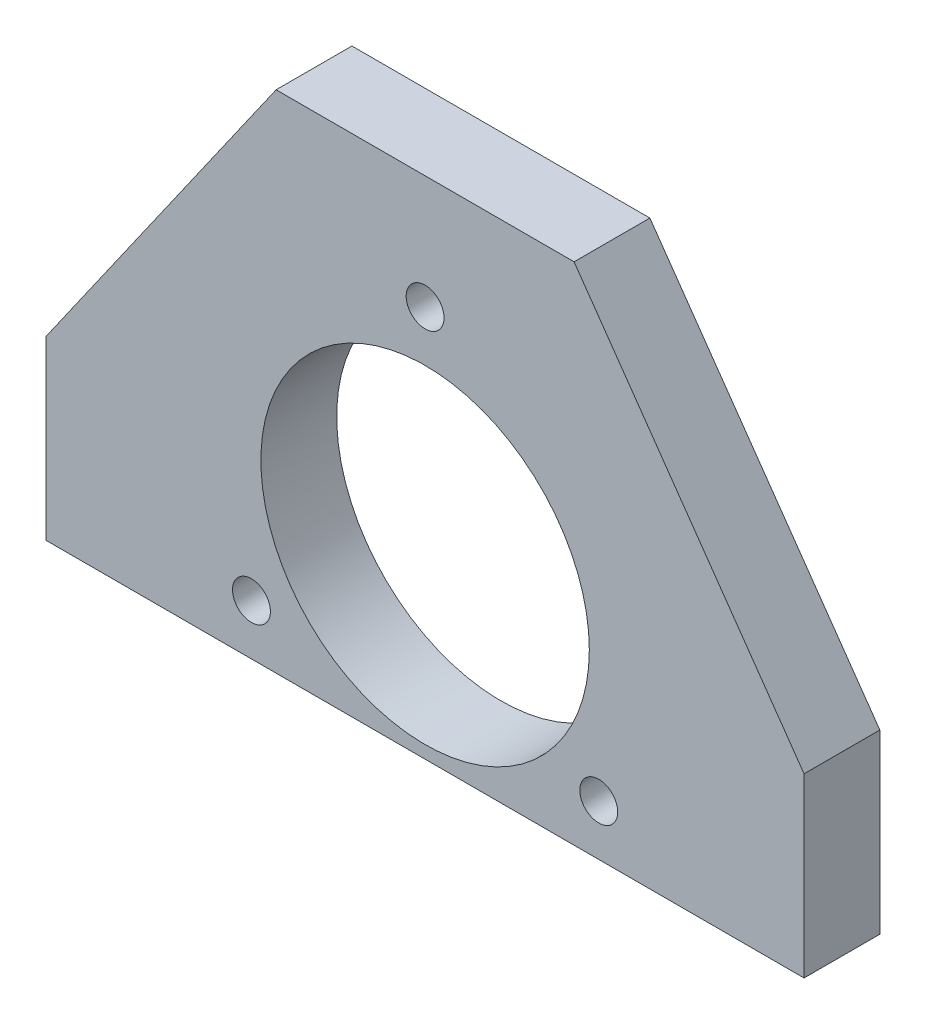
ISO-10303-21;
HEADER;
FILE_DESCRIPTION(('STEP AP214'),'2;1');
FILE_NAME('part.step','',(''),(''),'','','');
FILE_SCHEMA(('AUTOMOTIVE_DESIGN { 1 0 10303 214 1 1 1 1 }'));
ENDSEC;
DATA;
#1=APPLICATION_CONTEXT('core data for automotive mechanical design processes');
#2=APPLICATION_PROTOCOL_DEFINITION('international standard','automotive_design',2000,#1);
#3=PRODUCT_CONTEXT('',#1,'mechanical');
#4=PRODUCT('Part','Part','',(#3));
#5=PRODUCT_RELATED_PRODUCT_CATEGORY('part','',(#4));
#6=PRODUCT_DEFINITION_FORMATION('','',#4);
#7=PRODUCT_DEFINITION_CONTEXT('part definition',#1,'design');
#8=PRODUCT_DEFINITION('design','',#6,#7);
#9=PRODUCT_DEFINITION_SHAPE('','',#8);
#10=(LENGTH_UNIT() NAMED_UNIT(*) SI_UNIT(.MILLI.,.METRE.));
#11=(NAMED_UNIT(*) PLANE_ANGLE_UNIT() SI_UNIT($,.RADIAN.));
#12=(NAMED_UNIT(*) SI_UNIT($,.STERADIAN.) SOLID_ANGLE_UNIT());
#13=UNCERTAINTY_MEASURE_WITH_UNIT(LENGTH_MEASURE(1.E-05),#10,'distance_accuracy_value','');
#14=(GEOMETRIC_REPRESENTATION_CONTEXT(3) GLOBAL_UNCERTAINTY_ASSIGNED_CONTEXT((#13)) GLOBAL_UNIT_ASSIGNED_CONTEXT((#10,
#11,#12)) REPRESENTATION_CONTEXT('',''));
#15=CARTESIAN_POINT('',(0.,0.,0.));
#16=DIRECTION('',(0.,0.,1.));
#17=DIRECTION('',(1.,0.,0.));
#18=AXIS2_PLACEMENT_3D('',#15,#16,#17);
#19=CARTESIAN_POINT('',(60.0000000000007,40.,6.));
#20=DIRECTION('',(0.,0.,-1.));
#21=DIRECTION('',(-1.,0.,0.));
#22=AXIS2_PLACEMENT_3D('',#19,#20,#21);
#23=PLANE('',#22);
#24=CARTESIAN_POINT('',(30.0000000000001,31.,6.));
#25=DIRECTION('',(0.,0.,1.));
#26=DIRECTION('',(1.,0.,0.));
#27=AXIS2_PLACEMENT_3D('',#24,#25,#26);
#28=CIRCLE('',#27,1.5);
#29=CARTESIAN_POINT('',(31.5000000000001,31.,6.));
#30=VERTEX_POINT('',#29);
#31=EDGE_CURVE('E152',#30,#30,#28,.T.);
#32=ORIENTED_EDGE('',*,*,#31,.F.);
#33=EDGE_LOOP('',(#32));
#34=FACE_BOUND('',#33,.T.);
#35=CARTESIAN_POINT('',(43.7477270848676,4.,6.));
#36=DIRECTION('',(0.,0.,1.));
#37=DIRECTION('',(1.,0.,0.));
#38=AXIS2_PLACEMENT_3D('',#35,#36,#37);
#39=CIRCLE('',#38,1.5);
#40=CARTESIAN_POINT('',(45.2477270848676,4.,6.));
#41=VERTEX_POINT('',#40);
#42=EDGE_CURVE('E142',#41,#41,#39,.T.);
#43=ORIENTED_EDGE('',*,*,#42,.F.);
#44=EDGE_LOOP('',(#43));
#45=FACE_BOUND('',#44,.T.);
#46=CARTESIAN_POINT('',(16.2522729151326,4.,6.));
#47=DIRECTION('',(0.,0.,1.));
#48=DIRECTION('',(1.,0.,0.));
#49=AXIS2_PLACEMENT_3D('',#46,#47,#48);
#50=CIRCLE('',#49,1.5);
#51=CARTESIAN_POINT('',(17.7522729151326,4.,6.));
#52=VERTEX_POINT('',#51);
#53=EDGE_CURVE('E139',#52,#52,#50,.T.);
#54=ORIENTED_EDGE('',*,*,#53,.F.);
#55=EDGE_LOOP('',(#54));
#56=FACE_BOUND('',#55,.T.);
#57=DIRECTION('',(-1.,0.,0.));
#58=VECTOR('',#57,1.);
#59=CARTESIAN_POINT('',(18.2053959934526,40.,6.));
#60=LINE('',#59,#58);
#61=CARTESIAN_POINT('',(41.7946040065476,40.,6.));
#62=VERTEX_POINT('',#61);
#63=CARTESIAN_POINT('',(18.2053959934526,40.,6.));
#64=VERTEX_POINT('',#63);
#65=EDGE_CURVE('E130',#62,#64,#60,.T.);
#66=ORIENTED_EDGE('',*,*,#65,.T.);
#67=DIRECTION('',(-0.57357643635105,-0.819152044288989,0.));
#68=VECTOR('',#67,1.);
#69=CARTESIAN_POINT('',(18.2053959934526,40.,6.));
#70=LINE('',#69,#68);
#71=CARTESIAN_POINT('',(0.,14.,6.));
#72=VERTEX_POINT('',#71);
#73=EDGE_CURVE('E88',#64,#72,#70,.T.);
#74=ORIENTED_EDGE('',*,*,#73,.T.);
#75=DIRECTION('',(0.,-1.,0.));
#76=VECTOR('',#75,1.);
#77=CARTESIAN_POINT('',(0.,14.,6.));
#78=LINE('',#77,#76);
#79=CARTESIAN_POINT('',(0.,0.,6.));
#80=VERTEX_POINT('',#79);
#81=EDGE_CURVE('E101',#72,#80,#78,.T.);
#82=ORIENTED_EDGE('',*,*,#81,.T.);
#83=DIRECTION('',(1.,0.,0.));
#84=VECTOR('',#83,1.);
#85=CARTESIAN_POINT('',(0.,0.,6.));
#86=LINE('',#85,#84);
#87=CARTESIAN_POINT('',(60.,0.,6.));
#88=VERTEX_POINT('',#87);
#89=EDGE_CURVE('E95',#80,#88,#86,.T.);
#90=ORIENTED_EDGE('',*,*,#89,.T.);
#91=DIRECTION('',(0.,1.,0.));
#92=VECTOR('',#91,1.);
#93=CARTESIAN_POINT('',(60.0000000000002,13.9999999999996,6.));
#94=LINE('',#93,#92);
#95=CARTESIAN_POINT('',(60.0000000000002,13.9999999999996,6.));
#96=VERTEX_POINT('',#95);
#97=EDGE_CURVE('E99',#88,#96,#94,.T.);
#98=ORIENTED_EDGE('',*,*,#97,.T.);
#99=DIRECTION('',(-0.573576436351044,0.819152044288993,0.));
#100=VECTOR('',#99,1.);
#101=CARTESIAN_POINT('',(41.7946040065476,40.,6.));
#102=LINE('',#101,#100);
#103=EDGE_CURVE('E51',#96,#62,#102,.T.);
#104=ORIENTED_EDGE('',*,*,#103,.T.);
#105=EDGE_LOOP('',(#66,#74,#82,#90,#98,#104));
#106=FACE_BOUND('',#105,.T.);
#107=CARTESIAN_POINT('',(30.0000000000001,14.,6.));
#108=DIRECTION('',(0.,0.,1.));
#109=DIRECTION('',(1.,0.,0.));
#110=AXIS2_PLACEMENT_3D('',#107,#108,#109);
#111=CIRCLE('',#110,13.);
#112=CARTESIAN_POINT('',(43.0000000000001,14.,6.));
#113=VERTEX_POINT('',#112);
#114=EDGE_CURVE('E123',#113,#113,#111,.T.);
#115=ORIENTED_EDGE('',*,*,#114,.F.);
#116=EDGE_LOOP('',(#115));
#117=FACE_BOUND('',#116,.T.);
#118=ADVANCED_FACE('F32',(#34,#45,#56,#106,#117),#23,.F.);
#119=CARTESIAN_POINT('',(60.0000000000007,40.,0.));
#120=DIRECTION('',(0.,0.,-1.));
#121=DIRECTION('',(-1.,0.,0.));
#122=AXIS2_PLACEMENT_3D('',#119,#120,#121);
#123=PLANE('',#122);
#124=CARTESIAN_POINT('',(30.0000000000001,31.,0.));
#125=DIRECTION('',(0.,0.,-1.));
#126=DIRECTION('',(-1.,0.,0.));
#127=AXIS2_PLACEMENT_3D('',#124,#125,#126);
#128=CIRCLE('',#127,1.5);
#129=CARTESIAN_POINT('',(28.5000000000001,31.,0.));
#130=VERTEX_POINT('',#129);
#131=EDGE_CURVE('E36',#130,#130,#128,.T.);
#132=ORIENTED_EDGE('',*,*,#131,.F.);
#133=EDGE_LOOP('',(#132));
#134=FACE_BOUND('',#133,.T.);
#135=CARTESIAN_POINT('',(43.7477270848676,4.,0.));
#136=DIRECTION('',(0.,0.,-1.));
#137=DIRECTION('',(-1.,0.,0.));
#138=AXIS2_PLACEMENT_3D('',#135,#136,#137);
#139=CIRCLE('',#138,1.5);
#140=CARTESIAN_POINT('',(42.2477270848676,4.,0.));
#141=VERTEX_POINT('',#140);
#142=EDGE_CURVE('E140',#141,#141,#139,.T.);
#143=ORIENTED_EDGE('',*,*,#142,.F.);
#144=EDGE_LOOP('',(#143));
#145=FACE_BOUND('',#144,.T.);
#146=CARTESIAN_POINT('',(16.2522729151326,4.,0.));
#147=DIRECTION('',(0.,0.,-1.));
#148=DIRECTION('',(-1.,0.,0.));
#149=AXIS2_PLACEMENT_3D('',#146,#147,#148);
#150=CIRCLE('',#149,1.5);
#151=CARTESIAN_POINT('',(14.7522729151326,4.,0.));
#152=VERTEX_POINT('',#151);
#153=EDGE_CURVE('E136',#152,#152,#150,.T.);
#154=ORIENTED_EDGE('',*,*,#153,.F.);
#155=EDGE_LOOP('',(#154));
#156=FACE_BOUND('',#155,.T.);
#157=DIRECTION('',(-1.,0.,0.));
#158=VECTOR('',#157,1.);
#159=CARTESIAN_POINT('',(18.2053959934526,40.,0.));
#160=LINE('',#159,#158);
#161=CARTESIAN_POINT('',(41.7946040065476,40.,0.));
#162=VERTEX_POINT('',#161);
#163=CARTESIAN_POINT('',(18.2053959934526,40.,0.));
#164=VERTEX_POINT('',#163);
#165=EDGE_CURVE('E119',#162,#164,#160,.T.);
#166=ORIENTED_EDGE('',*,*,#165,.F.);
#167=DIRECTION('',(-0.573576436351044,0.819152044288993,0.));
#168=VECTOR('',#167,1.);
#169=CARTESIAN_POINT('',(41.7946040065476,40.,0.));
#170=LINE('',#169,#168);
#171=CARTESIAN_POINT('',(60.0000000000002,13.9999999999996,0.));
#172=VERTEX_POINT('',#171);
#173=EDGE_CURVE('E80',#172,#162,#170,.T.);
#174=ORIENTED_EDGE('',*,*,#173,.F.);
#175=DIRECTION('',(0.,1.,0.));
#176=VECTOR('',#175,1.);
#177=CARTESIAN_POINT('',(60.0000000000002,13.9999999999996,0.));
#178=LINE('',#177,#176);
#179=CARTESIAN_POINT('',(60.,0.,0.));
#180=VERTEX_POINT('',#179);
#181=EDGE_CURVE('E74',#180,#172,#178,.T.);
#182=ORIENTED_EDGE('',*,*,#181,.F.);
#183=DIRECTION('',(1.,0.,0.));
#184=VECTOR('',#183,1.);
#185=CARTESIAN_POINT('',(0.,0.,0.));
#186=LINE('',#185,#184);
#187=CARTESIAN_POINT('',(0.,0.,0.));
#188=VERTEX_POINT('',#187);
#189=EDGE_CURVE('E109',#188,#180,#186,.T.);
#190=ORIENTED_EDGE('',*,*,#189,.F.);
#191=DIRECTION('',(0.,-1.,0.));
#192=VECTOR('',#191,1.);
#193=CARTESIAN_POINT('',(0.,14.,0.));
#194=LINE('',#193,#192);
#195=CARTESIAN_POINT('',(0.,14.,0.));
#196=VERTEX_POINT('',#195);
#197=EDGE_CURVE('E125',#196,#188,#194,.T.);
#198=ORIENTED_EDGE('',*,*,#197,.F.);
#199=DIRECTION('',(-0.57357643635105,-0.819152044288989,0.));
#200=VECTOR('',#199,1.);
#201=CARTESIAN_POINT('',(18.2053959934526,40.,0.));
#202=LINE('',#201,#200);
#203=EDGE_CURVE('E122',#164,#196,#202,.T.);
#204=ORIENTED_EDGE('',*,*,#203,.F.);
#205=EDGE_LOOP('',(#166,#174,#182,#190,#198,#204));
#206=FACE_BOUND('',#205,.T.);
#207=CARTESIAN_POINT('',(30.0000000000001,14.,0.));
#208=DIRECTION('',(0.,0.,1.));
#209=DIRECTION('',(1.,0.,0.));
#210=AXIS2_PLACEMENT_3D('',#207,#208,#209);
#211=CIRCLE('',#210,13.);
#212=CARTESIAN_POINT('',(43.0000000000001,14.,0.));
#213=VERTEX_POINT('',#212);
#214=EDGE_CURVE('E138',#213,#213,#211,.T.);
#215=ORIENTED_EDGE('',*,*,#214,.T.);
#216=EDGE_LOOP('',(#215));
#217=FACE_BOUND('',#216,.T.);
#218=ADVANCED_FACE('F168',(#134,#145,#156,#206,#217),#123,.T.);
#219=CARTESIAN_POINT('',(18.2053959934526,40.,6.));
#220=DIRECTION('',(0.,-1.,0.));
#221=DIRECTION('',(0.,0.,-1.));
#222=AXIS2_PLACEMENT_3D('',#219,#220,#221);
#223=PLANE('',#222);
#224=ORIENTED_EDGE('',*,*,#165,.T.);
#225=DIRECTION('',(0.,0.,-1.));
#226=VECTOR('',#225,1.);
#227=CARTESIAN_POINT('',(18.2053959934526,40.,6.));
#228=LINE('',#227,#226);
#229=EDGE_CURVE('E11',#64,#164,#228,.T.);
#230=ORIENTED_EDGE('',*,*,#229,.F.);
#231=ORIENTED_EDGE('',*,*,#65,.F.);
#232=DIRECTION('',(0.,0.,-1.));
#233=VECTOR('',#232,1.);
#234=CARTESIAN_POINT('',(41.7946040065476,40.,6.));
#235=LINE('',#234,#233);
#236=EDGE_CURVE('E115',#62,#162,#235,.T.);
#237=ORIENTED_EDGE('',*,*,#236,.T.);
#238=EDGE_LOOP('',(#224,#230,#231,#237));
#239=FACE_BOUND('',#238,.T.);
#240=ADVANCED_FACE('F34',(#239),#223,.F.);
#241=CARTESIAN_POINT('',(18.2053959934526,40.,6.));
#242=DIRECTION('',(0.819152044288989,-0.57357643635105,0.));
#243=DIRECTION('',(0.57357643635105,0.819152044288989,0.));
#244=AXIS2_PLACEMENT_3D('',#241,#242,#243);
#245=PLANE('',#244);
#246=ORIENTED_EDGE('',*,*,#203,.T.);
#247=DIRECTION('',(0.,0.,-1.));
#248=VECTOR('',#247,1.);
#249=CARTESIAN_POINT('',(0.,14.,6.));
#250=LINE('',#249,#248);
#251=EDGE_CURVE('E42',#72,#196,#250,.T.);
#252=ORIENTED_EDGE('',*,*,#251,.F.);
#253=ORIENTED_EDGE('',*,*,#73,.F.);
#254=ORIENTED_EDGE('',*,*,#229,.T.);
#255=EDGE_LOOP('',(#246,#252,#253,#254));
#256=FACE_BOUND('',#255,.T.);
#257=ADVANCED_FACE('F162',(#256),#245,.F.);
#258=CARTESIAN_POINT('',(0.,14.,6.));
#259=DIRECTION('',(1.,0.,0.));
#260=DIRECTION('',(0.,1.,0.));
#261=AXIS2_PLACEMENT_3D('',#258,#259,#260);
#262=PLANE('',#261);
#263=ORIENTED_EDGE('',*,*,#197,.T.);
#264=DIRECTION('',(0.,0.,-1.));
#265=VECTOR('',#264,1.);
#266=CARTESIAN_POINT('',(0.,0.,6.));
#267=LINE('',#266,#265);
#268=EDGE_CURVE('E110',#80,#188,#267,.T.);
#269=ORIENTED_EDGE('',*,*,#268,.F.);
#270=ORIENTED_EDGE('',*,*,#81,.F.);
#271=ORIENTED_EDGE('',*,*,#251,.T.);
#272=EDGE_LOOP('',(#263,#269,#270,#271));
#273=FACE_BOUND('',#272,.T.);
#274=ADVANCED_FACE('F165',(#273),#262,.F.);
#275=CARTESIAN_POINT('',(0.,0.,6.));
#276=DIRECTION('',(0.,1.,0.));
#277=DIRECTION('',(0.,0.,1.));
#278=AXIS2_PLACEMENT_3D('',#275,#276,#277);
#279=PLANE('',#278);
#280=ORIENTED_EDGE('',*,*,#189,.T.);
#281=DIRECTION('',(0.,0.,-1.));
#282=VECTOR('',#281,1.);
#283=CARTESIAN_POINT('',(60.,0.,6.));
#284=LINE('',#283,#282);
#285=EDGE_CURVE('E106',#88,#180,#284,.T.);
#286=ORIENTED_EDGE('',*,*,#285,.F.);
#287=ORIENTED_EDGE('',*,*,#89,.F.);
#288=ORIENTED_EDGE('',*,*,#268,.T.);
#289=EDGE_LOOP('',(#280,#286,#287,#288));
#290=FACE_BOUND('',#289,.T.);
#291=ADVANCED_FACE('F107',(#290),#279,.F.);
#292=CARTESIAN_POINT('',(60.0000000000002,13.9999999999996,6.));
#293=DIRECTION('',(-1.,0.,0.));
#294=DIRECTION('',(0.,-1.,0.));
#295=AXIS2_PLACEMENT_3D('',#292,#293,#294);
#296=PLANE('',#295);
#297=ORIENTED_EDGE('',*,*,#181,.T.);
#298=DIRECTION('',(0.,0.,-1.));
#299=VECTOR('',#298,1.);
#300=CARTESIAN_POINT('',(60.0000000000002,13.9999999999996,6.));
#301=LINE('',#300,#299);
#302=EDGE_CURVE('E111',#96,#172,#301,.T.);
#303=ORIENTED_EDGE('',*,*,#302,.F.);
#304=ORIENTED_EDGE('',*,*,#97,.F.);
#305=ORIENTED_EDGE('',*,*,#285,.T.);
#306=EDGE_LOOP('',(#297,#303,#304,#305));
#307=FACE_BOUND('',#306,.T.);
#308=ADVANCED_FACE('F113',(#307),#296,.F.);
#309=CARTESIAN_POINT('',(41.7946040065476,40.,6.));
#310=DIRECTION('',(-0.819152044288993,-0.573576436351044,0.));
#311=DIRECTION('',(0.573576436351044,-0.819152044288993,0.));
#312=AXIS2_PLACEMENT_3D('',#309,#310,#311);
#313=PLANE('',#312);
#314=ORIENTED_EDGE('',*,*,#173,.T.);
#315=ORIENTED_EDGE('',*,*,#236,.F.);
#316=ORIENTED_EDGE('',*,*,#103,.F.);
#317=ORIENTED_EDGE('',*,*,#302,.T.);
#318=EDGE_LOOP('',(#314,#315,#316,#317));
#319=FACE_BOUND('',#318,.T.);
#320=ADVANCED_FACE('F171',(#319),#313,.F.);
#321=CARTESIAN_POINT('',(30.0000000000001,14.,6.));
#322=DIRECTION('',(0.,0.,-1.));
#323=DIRECTION('',(-1.,0.,0.));
#324=AXIS2_PLACEMENT_3D('',#321,#322,#323);
#325=CYLINDRICAL_SURFACE('',#324,13.);
#326=ORIENTED_EDGE('',*,*,#114,.T.);
#327=EDGE_LOOP('',(#326));
#328=FACE_BOUND('',#327,.T.);
#329=ORIENTED_EDGE('',*,*,#214,.F.);
#330=EDGE_LOOP('',(#329));
#331=FACE_BOUND('',#330,.T.);
#332=ADVANCED_FACE('F173',(#328,#331),#325,.F.);
#333=CARTESIAN_POINT('',(16.2522729151326,4.,-4.));
#334=DIRECTION('',(0.,0.,1.));
#335=DIRECTION('',(1.,0.,0.));
#336=AXIS2_PLACEMENT_3D('',#333,#334,#335);
#337=CYLINDRICAL_SURFACE('',#336,1.5);
#338=ORIENTED_EDGE('',*,*,#153,.T.);
#339=EDGE_LOOP('',(#338));
#340=FACE_BOUND('',#339,.T.);
#341=ORIENTED_EDGE('',*,*,#53,.T.);
#342=EDGE_LOOP('',(#341));
#343=FACE_BOUND('',#342,.T.);
#344=ADVANCED_FACE('F179',(#340,#343),#337,.F.);
#345=CARTESIAN_POINT('',(43.7477270848676,4.,-4.));
#346=DIRECTION('',(0.,0.,1.));
#347=DIRECTION('',(1.,0.,0.));
#348=AXIS2_PLACEMENT_3D('',#345,#346,#347);
#349=CYLINDRICAL_SURFACE('',#348,1.5);
#350=ORIENTED_EDGE('',*,*,#142,.T.);
#351=EDGE_LOOP('',(#350));
#352=FACE_BOUND('',#351,.T.);
#353=ORIENTED_EDGE('',*,*,#42,.T.);
#354=EDGE_LOOP('',(#353));
#355=FACE_BOUND('',#354,.T.);
#356=ADVANCED_FACE('F196',(#352,#355),#349,.F.);
#357=CARTESIAN_POINT('',(30.0000000000001,31.,-4.));
#358=DIRECTION('',(0.,0.,1.));
#359=DIRECTION('',(1.,0.,0.));
#360=AXIS2_PLACEMENT_3D('',#357,#358,#359);
#361=CYLINDRICAL_SURFACE('',#360,1.5);
#362=ORIENTED_EDGE('',*,*,#131,.T.);
#363=EDGE_LOOP('',(#362));
#364=FACE_BOUND('',#363,.T.);
#365=ORIENTED_EDGE('',*,*,#31,.T.);
#366=EDGE_LOOP('',(#365));
#367=FACE_BOUND('',#366,.T.);
#368=ADVANCED_FACE('F200',(#364,#367),#361,.F.);
#369=CLOSED_SHELL('',(#118,#218,#240,#257,#274,#291,#308,#320,#332,#344,#356,#368));
#370=MANIFOLD_SOLID_BREP('B2',#369);
#371=ADVANCED_BREP_SHAPE_REPRESENTATION('',(#18,#370),#14);
#372=SHAPE_DEFINITION_REPRESENTATION(#9,#371);
ENDSEC;
END-ISO-10303-21;
